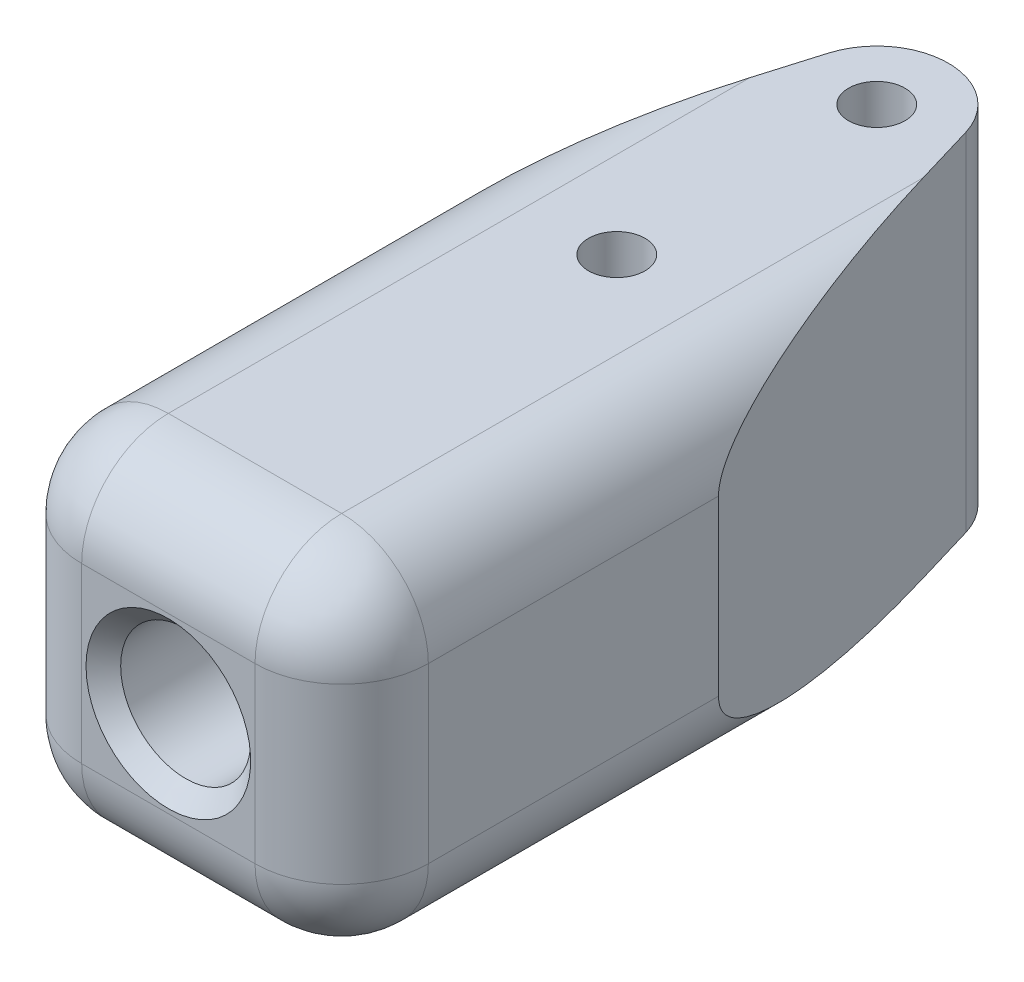
ISO-10303-21;
HEADER;
FILE_DESCRIPTION(('STEP AP214'),'2;1');
FILE_NAME('part.step','',(''),(''),'','','');
FILE_SCHEMA(('AUTOMOTIVE_DESIGN { 1 0 10303 214 1 1 1 1 }'));
ENDSEC;
DATA;
#1=APPLICATION_CONTEXT('core data for automotive mechanical design processes');
#2=APPLICATION_PROTOCOL_DEFINITION('international standard','automotive_design',2000,#1);
#3=PRODUCT_CONTEXT('',#1,'mechanical');
#4=PRODUCT('Part','Part','',(#3));
#5=PRODUCT_RELATED_PRODUCT_CATEGORY('part','',(#4));
#6=PRODUCT_DEFINITION_FORMATION('','',#4);
#7=PRODUCT_DEFINITION_CONTEXT('part definition',#1,'design');
#8=PRODUCT_DEFINITION('design','',#6,#7);
#9=PRODUCT_DEFINITION_SHAPE('','',#8);
#10=(LENGTH_UNIT() NAMED_UNIT(*) SI_UNIT(.MILLI.,.METRE.));
#11=(NAMED_UNIT(*) PLANE_ANGLE_UNIT() SI_UNIT($,.RADIAN.));
#12=(NAMED_UNIT(*) SI_UNIT($,.STERADIAN.) SOLID_ANGLE_UNIT());
#13=UNCERTAINTY_MEASURE_WITH_UNIT(LENGTH_MEASURE(1.E-05),#10,'distance_accuracy_value','');
#14=(GEOMETRIC_REPRESENTATION_CONTEXT(3) GLOBAL_UNCERTAINTY_ASSIGNED_CONTEXT((#13)) GLOBAL_UNIT_ASSIGNED_CONTEXT((#10,
#11,#12)) REPRESENTATION_CONTEXT('',''));
#15=CARTESIAN_POINT('',(0.,0.,0.));
#16=DIRECTION('',(0.,0.,1.));
#17=DIRECTION('',(1.,0.,0.));
#18=AXIS2_PLACEMENT_3D('',#15,#16,#17);
#19=CARTESIAN_POINT('',(12.7,-12.7,57.15));
#20=DIRECTION('',(0.,1.,0.));
#21=DIRECTION('',(-1.,0.,0.));
#22=AXIS2_PLACEMENT_3D('',#19,#20,#21);
#23=PLANE('',#22);
#24=CARTESIAN_POINT('',(0.,-12.7,24.2951));
#25=DIRECTION('',(0.,1.,0.));
#26=DIRECTION('',(-1.,0.,0.));
#27=AXIS2_PLACEMENT_3D('',#24,#25,#26);
#28=CIRCLE('',#27,2.0701);
#29=CARTESIAN_POINT('',(-2.0701,-12.7,24.2951));
#30=VERTEX_POINT('',#29);
#31=EDGE_CURVE('E324',#30,#30,#28,.T.);
#32=ORIENTED_EDGE('',*,*,#31,.T.);
#33=EDGE_LOOP('',(#32));
#34=FACE_BOUND('',#33,.T.);
#35=CARTESIAN_POINT('',(0.,-12.7,5.2451));
#36=DIRECTION('',(0.,1.,0.));
#37=DIRECTION('',(-1.,0.,0.));
#38=AXIS2_PLACEMENT_3D('',#35,#36,#37);
#39=CIRCLE('',#38,2.0701);
#40=CARTESIAN_POINT('',(-2.0701,-12.7,5.2451));
#41=VERTEX_POINT('',#40);
#42=EDGE_CURVE('E327',#41,#41,#39,.T.);
#43=ORIENTED_EDGE('',*,*,#42,.T.);
#44=EDGE_LOOP('',(#43));
#45=FACE_BOUND('',#44,.T.);
#46=DIRECTION('',(1.,0.,0.));
#47=VECTOR('',#46,1.);
#48=CARTESIAN_POINT('',(12.7,-12.7,50.8));
#49=LINE('',#48,#47);
#50=CARTESIAN_POINT('',(6.35,-12.7,50.8));
#51=VERTEX_POINT('',#50);
#52=CARTESIAN_POINT('',(-6.35,-12.7,50.8));
#53=VERTEX_POINT('',#52);
#54=EDGE_CURVE('E351',#51,#53,#49,.F.);
#55=ORIENTED_EDGE('',*,*,#54,.T.);
#56=DIRECTION('',(0.,0.,-1.));
#57=VECTOR('',#56,1.);
#58=CARTESIAN_POINT('',(-6.35,-12.7,57.15));
#59=LINE('',#58,#57);
#60=CARTESIAN_POINT('',(-6.35,-12.7,8.19542875797748));
#61=VERTEX_POINT('',#60);
#62=EDGE_CURVE('E301',#53,#61,#59,.T.);
#63=ORIENTED_EDGE('',*,*,#62,.T.);
#64=DIRECTION('',(0.285145907768039,0.,-0.958484121560259));
#65=VECTOR('',#64,1.);
#66=CARTESIAN_POINT('',(-3.59381819348919,-12.7,-1.06914922019534));
#67=LINE('',#66,#65);
#68=CARTESIAN_POINT('',(-5.02734506599571,-12.7,3.74948119916586));
#69=VERTEX_POINT('',#68);
#70=EDGE_CURVE('E296',#61,#69,#67,.T.);
#71=ORIENTED_EDGE('',*,*,#70,.T.);
#72=CARTESIAN_POINT('',(0.,-12.7,5.2451));
#73=DIRECTION('',(0.,1.,0.));
#74=DIRECTION('',(-1.,0.,0.));
#75=AXIS2_PLACEMENT_3D('',#72,#73,#74);
#76=CIRCLE('',#75,5.2451);
#77=CARTESIAN_POINT('',(5.02734506599572,-12.7,3.74948119916586));
#78=VERTEX_POINT('',#77);
#79=EDGE_CURVE('E299',#78,#69,#76,.T.);
#80=ORIENTED_EDGE('',*,*,#79,.F.);
#81=DIRECTION('',(-0.285145907768039,0.,-0.958484121560259));
#82=VECTOR('',#81,1.);
#83=CARTESIAN_POINT('',(3.5938181934892,-12.7,-1.06914922019534));
#84=LINE('',#83,#82);
#85=CARTESIAN_POINT('',(6.35,-12.7,8.19542875797748));
#86=VERTEX_POINT('',#85);
#87=EDGE_CURVE('E313',#86,#78,#84,.T.);
#88=ORIENTED_EDGE('',*,*,#87,.F.);
#89=DIRECTION('',(0.,0.,-1.));
#90=VECTOR('',#89,1.);
#91=CARTESIAN_POINT('',(6.35,-12.7,57.15));
#92=LINE('',#91,#90);
#93=EDGE_CURVE('E353',#86,#51,#92,.F.);
#94=ORIENTED_EDGE('',*,*,#93,.T.);
#95=EDGE_LOOP('',(#55,#63,#71,#80,#88,#94));
#96=FACE_BOUND('',#95,.T.);
#97=ADVANCED_FACE('F203',(#34,#45,#96),#23,.F.);
#98=CARTESIAN_POINT('',(12.7,12.7,57.15));
#99=DIRECTION('',(0.,-1.,0.));
#100=DIRECTION('',(1.,0.,0.));
#101=AXIS2_PLACEMENT_3D('',#98,#99,#100);
#102=PLANE('',#101);
#103=CARTESIAN_POINT('',(0.,12.7,24.2951));
#104=DIRECTION('',(0.,-1.,0.));
#105=DIRECTION('',(1.,0.,0.));
#106=AXIS2_PLACEMENT_3D('',#103,#104,#105);
#107=CIRCLE('',#106,2.0701);
#108=CARTESIAN_POINT('',(-2.0701,12.7,24.2951));
#109=VERTEX_POINT('',#108);
#110=EDGE_CURVE('E305',#109,#109,#107,.T.);
#111=ORIENTED_EDGE('',*,*,#110,.T.);
#112=EDGE_LOOP('',(#111));
#113=FACE_BOUND('',#112,.T.);
#114=CARTESIAN_POINT('',(0.,12.7,5.2451));
#115=DIRECTION('',(0.,-1.,0.));
#116=DIRECTION('',(1.,0.,0.));
#117=AXIS2_PLACEMENT_3D('',#114,#115,#116);
#118=CIRCLE('',#117,2.0701);
#119=CARTESIAN_POINT('',(-2.0701,12.7,5.2451));
#120=VERTEX_POINT('',#119);
#121=EDGE_CURVE('E314',#120,#120,#118,.T.);
#122=ORIENTED_EDGE('',*,*,#121,.T.);
#123=EDGE_LOOP('',(#122));
#124=FACE_BOUND('',#123,.T.);
#125=DIRECTION('',(-1.,0.,0.));
#126=VECTOR('',#125,1.);
#127=CARTESIAN_POINT('',(12.7,12.7,50.8));
#128=LINE('',#127,#126);
#129=CARTESIAN_POINT('',(-6.35,12.7,50.8));
#130=VERTEX_POINT('',#129);
#131=CARTESIAN_POINT('',(6.35,12.7,50.8));
#132=VERTEX_POINT('',#131);
#133=EDGE_CURVE('E396',#130,#132,#128,.F.);
#134=ORIENTED_EDGE('',*,*,#133,.T.);
#135=DIRECTION('',(0.,0.,-1.));
#136=VECTOR('',#135,1.);
#137=CARTESIAN_POINT('',(6.35,12.7,57.15));
#138=LINE('',#137,#136);
#139=CARTESIAN_POINT('',(6.35,12.7,8.19542875797748));
#140=VERTEX_POINT('',#139);
#141=EDGE_CURVE('E398',#132,#140,#138,.T.);
#142=ORIENTED_EDGE('',*,*,#141,.T.);
#143=DIRECTION('',(-0.285145907768039,0.,-0.958484121560259));
#144=VECTOR('',#143,1.);
#145=CARTESIAN_POINT('',(3.5938181934892,12.7,-1.06914922019534));
#146=LINE('',#145,#144);
#147=CARTESIAN_POINT('',(5.02734506599572,12.7,3.74948119916586));
#148=VERTEX_POINT('',#147);
#149=EDGE_CURVE('E336',#148,#140,#146,.F.);
#150=ORIENTED_EDGE('',*,*,#149,.F.);
#151=CARTESIAN_POINT('',(0.,12.7,5.2451));
#152=DIRECTION('',(0.,1.,0.));
#153=DIRECTION('',(-1.,0.,0.));
#154=AXIS2_PLACEMENT_3D('',#151,#152,#153);
#155=CIRCLE('',#154,5.2451);
#156=CARTESIAN_POINT('',(-5.02734506599572,12.7,3.74948119916586));
#157=VERTEX_POINT('',#156);
#158=EDGE_CURVE('E335',#148,#157,#155,.T.);
#159=ORIENTED_EDGE('',*,*,#158,.T.);
#160=DIRECTION('',(0.285145907768039,0.,-0.958484121560259));
#161=VECTOR('',#160,1.);
#162=CARTESIAN_POINT('',(-3.5938181934892,12.7,-1.06914922019535));
#163=LINE('',#162,#161);
#164=CARTESIAN_POINT('',(-6.35,12.7,8.19542875797749));
#165=VERTEX_POINT('',#164);
#166=EDGE_CURVE('E318',#165,#157,#163,.T.);
#167=ORIENTED_EDGE('',*,*,#166,.F.);
#168=DIRECTION('',(0.,0.,-1.));
#169=VECTOR('',#168,1.);
#170=CARTESIAN_POINT('',(-6.35,12.7,57.15));
#171=LINE('',#170,#169);
#172=EDGE_CURVE('E375',#165,#130,#171,.F.);
#173=ORIENTED_EDGE('',*,*,#172,.T.);
#174=EDGE_LOOP('',(#134,#142,#150,#159,#167,#173));
#175=FACE_BOUND('',#174,.T.);
#176=ADVANCED_FACE('F430',(#113,#124,#175),#102,.F.);
#177=CARTESIAN_POINT('',(12.7,12.7,57.15));
#178=DIRECTION('',(-1.,0.,0.));
#179=DIRECTION('',(0.,-1.,0.));
#180=AXIS2_PLACEMENT_3D('',#177,#178,#179);
#181=PLANE('',#180);
#182=DIRECTION('',(0.,1.,0.));
#183=VECTOR('',#182,1.);
#184=CARTESIAN_POINT('',(12.7,-12.7,29.5402));
#185=LINE('',#184,#183);
#186=CARTESIAN_POINT('',(12.7,-6.35,29.5402));
#187=VERTEX_POINT('',#186);
#188=CARTESIAN_POINT('',(12.7,6.35,29.5402));
#189=VERTEX_POINT('',#188);
#190=EDGE_CURVE('E332',#187,#189,#185,.T.);
#191=ORIENTED_EDGE('',*,*,#190,.T.);
#192=DIRECTION('',(0.,0.,-1.));
#193=VECTOR('',#192,1.);
#194=CARTESIAN_POINT('',(12.7,6.35,57.15));
#195=LINE('',#194,#193);
#196=CARTESIAN_POINT('',(12.7,6.35,50.8));
#197=VERTEX_POINT('',#196);
#198=EDGE_CURVE('E403',#189,#197,#195,.F.);
#199=ORIENTED_EDGE('',*,*,#198,.T.);
#200=DIRECTION('',(0.,1.,0.));
#201=VECTOR('',#200,1.);
#202=CARTESIAN_POINT('',(12.7,12.7,50.8));
#203=LINE('',#202,#201);
#204=CARTESIAN_POINT('',(12.7,-6.34999999999999,50.8));
#205=VERTEX_POINT('',#204);
#206=EDGE_CURVE('E362',#197,#205,#203,.F.);
#207=ORIENTED_EDGE('',*,*,#206,.T.);
#208=DIRECTION('',(0.,0.,-1.));
#209=VECTOR('',#208,1.);
#210=CARTESIAN_POINT('',(12.7,-6.34999999999999,57.15));
#211=LINE('',#210,#209);
#212=EDGE_CURVE('E364',#205,#187,#211,.T.);
#213=ORIENTED_EDGE('',*,*,#212,.T.);
#214=EDGE_LOOP('',(#191,#199,#207,#213));
#215=FACE_BOUND('',#214,.T.);
#216=ADVANCED_FACE('F473',(#215),#181,.F.);
#217=CARTESIAN_POINT('',(-12.7,12.7,57.15));
#218=DIRECTION('',(1.,0.,0.));
#219=DIRECTION('',(0.,1.,0.));
#220=AXIS2_PLACEMENT_3D('',#217,#218,#219);
#221=PLANE('',#220);
#222=DIRECTION('',(0.,-1.,0.));
#223=VECTOR('',#222,1.);
#224=CARTESIAN_POINT('',(-12.7,12.7,50.8));
#225=LINE('',#224,#223);
#226=CARTESIAN_POINT('',(-12.7,-6.35,50.8));
#227=VERTEX_POINT('',#226);
#228=CARTESIAN_POINT('',(-12.7,6.35,50.8));
#229=VERTEX_POINT('',#228);
#230=EDGE_CURVE('E358',#227,#229,#225,.F.);
#231=ORIENTED_EDGE('',*,*,#230,.T.);
#232=DIRECTION('',(0.,0.,-1.));
#233=VECTOR('',#232,1.);
#234=CARTESIAN_POINT('',(-12.7,6.35,57.15));
#235=LINE('',#234,#233);
#236=CARTESIAN_POINT('',(-12.7,6.35,29.5402));
#237=VERTEX_POINT('',#236);
#238=EDGE_CURVE('E212',#229,#237,#235,.T.);
#239=ORIENTED_EDGE('',*,*,#238,.T.);
#240=DIRECTION('',(0.,1.,0.));
#241=VECTOR('',#240,1.);
#242=CARTESIAN_POINT('',(-12.7,-12.7,29.5402));
#243=LINE('',#242,#241);
#244=CARTESIAN_POINT('',(-12.7,-6.35,29.5402));
#245=VERTEX_POINT('',#244);
#246=EDGE_CURVE('E320',#245,#237,#243,.T.);
#247=ORIENTED_EDGE('',*,*,#246,.F.);
#248=DIRECTION('',(0.,0.,-1.));
#249=VECTOR('',#248,1.);
#250=CARTESIAN_POINT('',(-12.7,-6.35,57.15));
#251=LINE('',#250,#249);
#252=EDGE_CURVE('E360',#245,#227,#251,.F.);
#253=ORIENTED_EDGE('',*,*,#252,.T.);
#254=EDGE_LOOP('',(#231,#239,#247,#253));
#255=FACE_BOUND('',#254,.T.);
#256=ADVANCED_FACE('F457',(#255),#221,.F.);
#257=CARTESIAN_POINT('',(0.,0.,57.15));
#258=DIRECTION('',(0.,0.,-1.));
#259=DIRECTION('',(-1.,0.,0.));
#260=AXIS2_PLACEMENT_3D('',#257,#258,#259);
#261=PLANE('',#260);
#262=CARTESIAN_POINT('',(0.,0.,57.15));
#263=DIRECTION('',(0.,0.,-1.));
#264=DIRECTION('',(-1.,0.,0.));
#265=AXIS2_PLACEMENT_3D('',#262,#263,#264);
#266=CIRCLE('',#265,6.0325);
#267=CARTESIAN_POINT('',(-6.0325,0.,57.15));
#268=VERTEX_POINT('',#267);
#269=EDGE_CURVE('E348',#268,#268,#266,.T.);
#270=ORIENTED_EDGE('',*,*,#269,.T.);
#271=EDGE_LOOP('',(#270));
#272=FACE_BOUND('',#271,.T.);
#273=DIRECTION('',(0.,1.,0.));
#274=VECTOR('',#273,1.);
#275=CARTESIAN_POINT('',(6.35,0.,57.15));
#276=LINE('',#275,#274);
#277=CARTESIAN_POINT('',(6.35,-6.35,57.15));
#278=VERTEX_POINT('',#277);
#279=CARTESIAN_POINT('',(6.35,6.35,57.15));
#280=VERTEX_POINT('',#279);
#281=EDGE_CURVE('E368',#278,#280,#276,.T.);
#282=ORIENTED_EDGE('',*,*,#281,.T.);
#283=DIRECTION('',(-1.,0.,0.));
#284=VECTOR('',#283,1.);
#285=CARTESIAN_POINT('',(0.,6.35,57.15));
#286=LINE('',#285,#284);
#287=CARTESIAN_POINT('',(-6.35,6.35,57.15));
#288=VERTEX_POINT('',#287);
#289=EDGE_CURVE('E407',#280,#288,#286,.T.);
#290=ORIENTED_EDGE('',*,*,#289,.T.);
#291=DIRECTION('',(0.,-1.,0.));
#292=VECTOR('',#291,1.);
#293=CARTESIAN_POINT('',(-6.35,0.,57.15));
#294=LINE('',#293,#292);
#295=CARTESIAN_POINT('',(-6.35,-6.35,57.15));
#296=VERTEX_POINT('',#295);
#297=EDGE_CURVE('E373',#288,#296,#294,.T.);
#298=ORIENTED_EDGE('',*,*,#297,.T.);
#299=DIRECTION('',(1.,0.,0.));
#300=VECTOR('',#299,1.);
#301=CARTESIAN_POINT('',(0.,-6.35,57.15));
#302=LINE('',#301,#300);
#303=EDGE_CURVE('E371',#296,#278,#302,.T.);
#304=ORIENTED_EDGE('',*,*,#303,.T.);
#305=EDGE_LOOP('',(#282,#290,#298,#304));
#306=FACE_BOUND('',#305,.T.);
#307=ADVANCED_FACE('F460',(#272,#306),#261,.F.);
#308=CARTESIAN_POINT('',(3.5938181934892,-12.7,-1.06914922019534));
#309=DIRECTION('',(0.958484121560259,0.,-0.285145907768039));
#310=DIRECTION('',(-0.285145907768039,0.,-0.958484121560259));
#311=AXIS2_PLACEMENT_3D('',#308,#309,#310);
#312=PLANE('',#311);
#313=ORIENTED_EDGE('',*,*,#149,.T.);
#314=CARTESIAN_POINT('',(6.35,6.35,8.19542875797748));
#315=DIRECTION('',(0.958484121560259,0.,-0.285145907768039));
#316=DIRECTION('',(-0.285145907768039,0.,-0.958484121560259));
#317=AXIS2_PLACEMENT_3D('',#314,#315,#316);
#318=ELLIPSE('',#317,22.2693008281417,6.35);
#319=EDGE_CURVE('E401',#140,#189,#318,.T.);
#320=ORIENTED_EDGE('',*,*,#319,.T.);
#321=ORIENTED_EDGE('',*,*,#190,.F.);
#322=CARTESIAN_POINT('',(6.35,-6.34999999999999,8.19542875797748));
#323=DIRECTION('',(0.958484121560259,0.,-0.285145907768039));
#324=DIRECTION('',(-0.285145907768039,0.,-0.958484121560259));
#325=AXIS2_PLACEMENT_3D('',#322,#323,#324);
#326=ELLIPSE('',#325,22.2693008281417,6.35);
#327=EDGE_CURVE('E366',#187,#86,#326,.T.);
#328=ORIENTED_EDGE('',*,*,#327,.T.);
#329=ORIENTED_EDGE('',*,*,#87,.T.);
#330=DIRECTION('',(0.,1.,0.));
#331=VECTOR('',#330,1.);
#332=CARTESIAN_POINT('',(5.02734506599572,-12.7,3.74948119916586));
#333=LINE('',#332,#331);
#334=EDGE_CURVE('E312',#78,#148,#333,.T.);
#335=ORIENTED_EDGE('',*,*,#334,.T.);
#336=EDGE_LOOP('',(#313,#320,#321,#328,#329,#335));
#337=FACE_BOUND('',#336,.T.);
#338=ADVANCED_FACE('F433',(#337),#312,.T.);
#339=CARTESIAN_POINT('',(0.,-12.7,5.2451));
#340=DIRECTION('',(0.,1.,0.));
#341=DIRECTION('',(-1.,0.,0.));
#342=AXIS2_PLACEMENT_3D('',#339,#340,#341);
#343=CYLINDRICAL_SURFACE('',#342,5.2451);
#344=ORIENTED_EDGE('',*,*,#158,.F.);
#345=ORIENTED_EDGE('',*,*,#334,.F.);
#346=ORIENTED_EDGE('',*,*,#79,.T.);
#347=DIRECTION('',(0.,1.,0.));
#348=VECTOR('',#347,1.);
#349=CARTESIAN_POINT('',(-5.02734506599571,-12.7,3.74948119916586));
#350=LINE('',#349,#348);
#351=EDGE_CURVE('E304',#69,#157,#350,.T.);
#352=ORIENTED_EDGE('',*,*,#351,.T.);
#353=EDGE_LOOP('',(#344,#345,#346,#352));
#354=FACE_BOUND('',#353,.T.);
#355=ADVANCED_FACE('F310',(#354),#343,.T.);
#356=CARTESIAN_POINT('',(0.,-12.7,5.2451));
#357=DIRECTION('',(0.,1.,0.));
#358=DIRECTION('',(-1.,0.,0.));
#359=AXIS2_PLACEMENT_3D('',#356,#357,#358);
#360=CYLINDRICAL_SURFACE('',#359,2.0701);
#361=CARTESIAN_POINT('',(-2.0701,-12.7,5.2451));
#362=CARTESIAN_POINT('',(-2.0701,-12.4354166666667,5.2451));
#363=CARTESIAN_POINT('',(-2.0701,-12.1708333333333,5.2451));
#364=CARTESIAN_POINT('',(-2.0701,-11.6416666666667,5.2451));
#365=CARTESIAN_POINT('',(-2.0701,-11.3770833333333,5.2451));
#366=CARTESIAN_POINT('',(-2.0701,-10.8479166666667,5.2451));
#367=CARTESIAN_POINT('',(-2.0701,-10.5833333333333,5.2451));
#368=CARTESIAN_POINT('',(-2.0701,-10.0541666666667,5.2451));
#369=CARTESIAN_POINT('',(-2.0701,-9.78958333333333,5.2451));
#370=CARTESIAN_POINT('',(-2.0701,-9.26041666666667,5.2451));
#371=CARTESIAN_POINT('',(-2.0701,-8.99583333333333,5.2451));
#372=CARTESIAN_POINT('',(-2.0701,-8.46666666666667,5.2451));
#373=CARTESIAN_POINT('',(-2.0701,-8.20208333333333,5.2451));
#374=CARTESIAN_POINT('',(-2.0701,-7.67291666666667,5.2451));
#375=CARTESIAN_POINT('',(-2.0701,-7.40833333333333,5.2451));
#376=CARTESIAN_POINT('',(-2.0701,-6.87916666666667,5.2451));
#377=CARTESIAN_POINT('',(-2.0701,-6.61458333333333,5.2451));
#378=CARTESIAN_POINT('',(-2.0701,-6.08541666666667,5.2451));
#379=CARTESIAN_POINT('',(-2.0701,-5.82083333333333,5.2451));
#380=CARTESIAN_POINT('',(-2.0701,-5.29166666666667,5.2451));
#381=CARTESIAN_POINT('',(-2.0701,-5.02708333333333,5.2451));
#382=CARTESIAN_POINT('',(-2.0701,-4.49791666666667,5.2451));
#383=CARTESIAN_POINT('',(-2.0701,-4.23333333333333,5.2451));
#384=CARTESIAN_POINT('',(-2.0701,-3.70416666666667,5.2451));
#385=CARTESIAN_POINT('',(-2.0701,-3.43958333333333,5.2451));
#386=CARTESIAN_POINT('',(-2.0701,-2.91041666666667,5.2451));
#387=CARTESIAN_POINT('',(-2.0701,-2.64583333333333,5.2451));
#388=CARTESIAN_POINT('',(-2.0701,-2.11666666666667,5.2451));
#389=CARTESIAN_POINT('',(-2.0701,-1.85208333333333,5.2451));
#390=CARTESIAN_POINT('',(-2.0701,-1.32291666666666,5.2451));
#391=CARTESIAN_POINT('',(-2.0701,-1.05833333333333,5.2451));
#392=CARTESIAN_POINT('',(-2.0701,-0.529166666666664,5.2451));
#393=CARTESIAN_POINT('',(-2.0701,-0.264583333333331,5.2451));
#394=CARTESIAN_POINT('',(-2.0701,0.264583333333335,5.2451));
#395=CARTESIAN_POINT('',(-2.0701,0.529166666666668,5.2451));
#396=CARTESIAN_POINT('',(-2.0701,1.05833333333333,5.2451));
#397=CARTESIAN_POINT('',(-2.0701,1.32291666666667,5.2451));
#398=CARTESIAN_POINT('',(-2.0701,1.85208333333334,5.2451));
#399=CARTESIAN_POINT('',(-2.0701,2.11666666666667,5.2451));
#400=CARTESIAN_POINT('',(-2.0701,2.64583333333334,5.2451));
#401=CARTESIAN_POINT('',(-2.0701,2.91041666666667,5.2451));
#402=CARTESIAN_POINT('',(-2.0701,3.43958333333333,5.2451));
#403=CARTESIAN_POINT('',(-2.0701,3.70416666666667,5.2451));
#404=CARTESIAN_POINT('',(-2.0701,4.23333333333333,5.2451));
#405=CARTESIAN_POINT('',(-2.0701,4.49791666666667,5.2451));
#406=CARTESIAN_POINT('',(-2.0701,5.02708333333334,5.2451));
#407=CARTESIAN_POINT('',(-2.0701,5.29166666666667,5.2451));
#408=CARTESIAN_POINT('',(-2.0701,5.82083333333333,5.2451));
#409=CARTESIAN_POINT('',(-2.0701,6.08541666666667,5.2451));
#410=CARTESIAN_POINT('',(-2.0701,6.61458333333333,5.2451));
#411=CARTESIAN_POINT('',(-2.0701,6.87916666666667,5.2451));
#412=CARTESIAN_POINT('',(-2.0701,7.40833333333333,5.2451));
#413=CARTESIAN_POINT('',(-2.0701,7.67291666666667,5.2451));
#414=CARTESIAN_POINT('',(-2.0701,8.20208333333333,5.2451));
#415=CARTESIAN_POINT('',(-2.0701,8.46666666666667,5.2451));
#416=CARTESIAN_POINT('',(-2.0701,8.99583333333334,5.2451));
#417=CARTESIAN_POINT('',(-2.0701,9.26041666666667,5.2451));
#418=CARTESIAN_POINT('',(-2.0701,9.78958333333334,5.2451));
#419=CARTESIAN_POINT('',(-2.0701,10.0541666666667,5.2451));
#420=CARTESIAN_POINT('',(-2.0701,10.5833333333333,5.2451));
#421=CARTESIAN_POINT('',(-2.0701,10.8479166666667,5.2451));
#422=CARTESIAN_POINT('',(-2.0701,11.3770833333333,5.2451));
#423=CARTESIAN_POINT('',(-2.0701,11.6416666666667,5.2451));
#424=CARTESIAN_POINT('',(-2.0701,12.1708333333333,5.2451));
#425=CARTESIAN_POINT('',(-2.0701,12.4354166666667,5.2451));
#426=CARTESIAN_POINT('',(-2.0701,12.7,5.2451));
#427=B_SPLINE_CURVE_WITH_KNOTS('',3,(#361,#362,#363,#364,#365,#366,#367,#368,#369,#370,#371,
#372,#373,#374,#375,#376,#377,#378,#379,#380,#381,#382,#383,#384,#385,#386,#387,#388,#389,#390,
#391,#392,#393,#394,#395,#396,#397,#398,#399,#400,#401,#402,#403,#404,#405,#406,#407,#408,#409,
#410,#411,#412,#413,#414,#415,#416,#417,#418,#419,#420,#421,#422,#423,#424,#425,#426),
.UNSPECIFIED.,.F.,.F.,(4,2,2,2,2,2,2,2,2,2,2,2,2,2,2,2,2,2,2,2,2,2,2,2,2,2,2,2,2,2,2,2,4),(0.,
0.793749999999999,1.5875,2.38125,3.175,3.96875,4.7625,5.55625,6.35,7.14375,7.9375,8.73125,9.525,
10.31875,11.1125,11.90625,12.7,13.49375,14.2875,15.08125,15.875,16.66875,17.4625,18.25625,19.05,
19.84375,20.6375,21.43125,22.225,23.01875,23.8125,24.60625,25.4),.UNSPECIFIED.);
#428=EDGE_CURVE('BSEAM614',#41,#120,#427,.T.);
#429=ORIENTED_EDGE('',*,*,#42,.F.);
#430=ORIENTED_EDGE('',*,*,#121,.F.);
#431=ORIENTED_EDGE('',*,*,#428,.T.);
#432=ORIENTED_EDGE('',*,*,#428,.F.);
#433=EDGE_LOOP('',(#429,#431,#430,#432));
#434=FACE_BOUND('',#433,.T.);
#435=ADVANCED_FACE('F614',(#434),#360,.F.);
#436=CARTESIAN_POINT('',(-3.59381819348919,-12.7,-1.06914922019534));
#437=DIRECTION('',(0.958484121560259,0.,0.285145907768039));
#438=DIRECTION('',(0.285145907768039,0.,-0.958484121560259));
#439=AXIS2_PLACEMENT_3D('',#436,#437,#438);
#440=PLANE('',#439);
#441=ORIENTED_EDGE('',*,*,#246,.T.);
#442=CARTESIAN_POINT('',(-6.35,6.35,8.19542875797748));
#443=DIRECTION('',(0.958484121560259,0.,0.285145907768039));
#444=DIRECTION('',(0.285145907768039,0.,-0.958484121560259));
#445=AXIS2_PLACEMENT_3D('',#442,#443,#444);
#446=ELLIPSE('',#445,22.2693008281417,6.35);
#447=EDGE_CURVE('E12',#237,#165,#446,.F.);
#448=ORIENTED_EDGE('',*,*,#447,.T.);
#449=ORIENTED_EDGE('',*,*,#166,.T.);
#450=ORIENTED_EDGE('',*,*,#351,.F.);
#451=ORIENTED_EDGE('',*,*,#70,.F.);
#452=CARTESIAN_POINT('',(-6.35,-6.35,8.19542875797748));
#453=DIRECTION('',(0.958484121560259,0.,0.285145907768039));
#454=DIRECTION('',(0.285145907768039,0.,-0.958484121560259));
#455=AXIS2_PLACEMENT_3D('',#452,#453,#454);
#456=ELLIPSE('',#455,22.2693008281417,6.35);
#457=EDGE_CURVE('E356',#61,#245,#456,.F.);
#458=ORIENTED_EDGE('',*,*,#457,.T.);
#459=EDGE_LOOP('',(#441,#448,#449,#450,#451,#458));
#460=FACE_BOUND('',#459,.T.);
#461=ADVANCED_FACE('F316',(#460),#440,.F.);
#462=CARTESIAN_POINT('',(0.,-12.7,24.2951));
#463=DIRECTION('',(0.,1.,0.));
#464=DIRECTION('',(-1.,0.,0.));
#465=AXIS2_PLACEMENT_3D('',#462,#463,#464);
#466=CYLINDRICAL_SURFACE('',#465,2.0701);
#467=CARTESIAN_POINT('',(-2.0701,-12.7,24.2951));
#468=CARTESIAN_POINT('',(-2.0701,-12.4354166666667,24.2951));
#469=CARTESIAN_POINT('',(-2.0701,-12.1708333333333,24.2951));
#470=CARTESIAN_POINT('',(-2.0701,-11.6416666666667,24.2951));
#471=CARTESIAN_POINT('',(-2.0701,-11.3770833333333,24.2951));
#472=CARTESIAN_POINT('',(-2.0701,-10.8479166666667,24.2951));
#473=CARTESIAN_POINT('',(-2.0701,-10.5833333333333,24.2951));
#474=CARTESIAN_POINT('',(-2.0701,-10.0541666666667,24.2951));
#475=CARTESIAN_POINT('',(-2.0701,-9.78958333333333,24.2951));
#476=CARTESIAN_POINT('',(-2.0701,-9.26041666666667,24.2951));
#477=CARTESIAN_POINT('',(-2.0701,-8.99583333333333,24.2951));
#478=CARTESIAN_POINT('',(-2.0701,-8.46666666666667,24.2951));
#479=CARTESIAN_POINT('',(-2.0701,-8.20208333333333,24.2951));
#480=CARTESIAN_POINT('',(-2.0701,-7.67291666666667,24.2951));
#481=CARTESIAN_POINT('',(-2.0701,-7.40833333333333,24.2951));
#482=CARTESIAN_POINT('',(-2.0701,-6.87916666666667,24.2951));
#483=CARTESIAN_POINT('',(-2.0701,-6.61458333333333,24.2951));
#484=CARTESIAN_POINT('',(-2.0701,-6.08541666666667,24.2951));
#485=CARTESIAN_POINT('',(-2.0701,-5.82083333333333,24.2951));
#486=CARTESIAN_POINT('',(-2.0701,-5.29166666666667,24.2951));
#487=CARTESIAN_POINT('',(-2.0701,-5.02708333333333,24.2951));
#488=CARTESIAN_POINT('',(-2.0701,-4.49791666666667,24.2951));
#489=CARTESIAN_POINT('',(-2.0701,-4.23333333333333,24.2951));
#490=CARTESIAN_POINT('',(-2.0701,-3.70416666666667,24.2951));
#491=CARTESIAN_POINT('',(-2.0701,-3.43958333333333,24.2951));
#492=CARTESIAN_POINT('',(-2.0701,-2.91041666666667,24.2951));
#493=CARTESIAN_POINT('',(-2.0701,-2.64583333333333,24.2951));
#494=CARTESIAN_POINT('',(-2.0701,-2.11666666666667,24.2951));
#495=CARTESIAN_POINT('',(-2.0701,-1.85208333333333,24.2951));
#496=CARTESIAN_POINT('',(-2.0701,-1.32291666666666,24.2951));
#497=CARTESIAN_POINT('',(-2.0701,-1.05833333333333,24.2951));
#498=CARTESIAN_POINT('',(-2.0701,-0.529166666666664,24.2951));
#499=CARTESIAN_POINT('',(-2.0701,-0.264583333333331,24.2951));
#500=CARTESIAN_POINT('',(-2.0701,0.264583333333335,24.2951));
#501=CARTESIAN_POINT('',(-2.0701,0.529166666666668,24.2951));
#502=CARTESIAN_POINT('',(-2.0701,1.05833333333333,24.2951));
#503=CARTESIAN_POINT('',(-2.0701,1.32291666666667,24.2951));
#504=CARTESIAN_POINT('',(-2.0701,1.85208333333334,24.2951));
#505=CARTESIAN_POINT('',(-2.0701,2.11666666666667,24.2951));
#506=CARTESIAN_POINT('',(-2.0701,2.64583333333334,24.2951));
#507=CARTESIAN_POINT('',(-2.0701,2.91041666666667,24.2951));
#508=CARTESIAN_POINT('',(-2.0701,3.43958333333333,24.2951));
#509=CARTESIAN_POINT('',(-2.0701,3.70416666666667,24.2951));
#510=CARTESIAN_POINT('',(-2.0701,4.23333333333333,24.2951));
#511=CARTESIAN_POINT('',(-2.0701,4.49791666666667,24.2951));
#512=CARTESIAN_POINT('',(-2.0701,5.02708333333334,24.2951));
#513=CARTESIAN_POINT('',(-2.0701,5.29166666666667,24.2951));
#514=CARTESIAN_POINT('',(-2.0701,5.82083333333333,24.2951));
#515=CARTESIAN_POINT('',(-2.0701,6.08541666666667,24.2951));
#516=CARTESIAN_POINT('',(-2.0701,6.61458333333333,24.2951));
#517=CARTESIAN_POINT('',(-2.0701,6.87916666666667,24.2951));
#518=CARTESIAN_POINT('',(-2.0701,7.40833333333333,24.2951));
#519=CARTESIAN_POINT('',(-2.0701,7.67291666666667,24.2951));
#520=CARTESIAN_POINT('',(-2.0701,8.20208333333333,24.2951));
#521=CARTESIAN_POINT('',(-2.0701,8.46666666666667,24.2951));
#522=CARTESIAN_POINT('',(-2.0701,8.99583333333334,24.2951));
#523=CARTESIAN_POINT('',(-2.0701,9.26041666666667,24.2951));
#524=CARTESIAN_POINT('',(-2.0701,9.78958333333334,24.2951));
#525=CARTESIAN_POINT('',(-2.0701,10.0541666666667,24.2951));
#526=CARTESIAN_POINT('',(-2.0701,10.5833333333333,24.2951));
#527=CARTESIAN_POINT('',(-2.0701,10.8479166666667,24.2951));
#528=CARTESIAN_POINT('',(-2.0701,11.3770833333333,24.2951));
#529=CARTESIAN_POINT('',(-2.0701,11.6416666666667,24.2951));
#530=CARTESIAN_POINT('',(-2.0701,12.1708333333333,24.2951));
#531=CARTESIAN_POINT('',(-2.0701,12.4354166666667,24.2951));
#532=CARTESIAN_POINT('',(-2.0701,12.7,24.2951));
#533=B_SPLINE_CURVE_WITH_KNOTS('',3,(#467,#468,#469,#470,#471,#472,#473,#474,#475,#476,#477,
#478,#479,#480,#481,#482,#483,#484,#485,#486,#487,#488,#489,#490,#491,#492,#493,#494,#495,#496,
#497,#498,#499,#500,#501,#502,#503,#504,#505,#506,#507,#508,#509,#510,#511,#512,#513,#514,#515,
#516,#517,#518,#519,#520,#521,#522,#523,#524,#525,#526,#527,#528,#529,#530,#531,#532),
.UNSPECIFIED.,.F.,.F.,(4,2,2,2,2,2,2,2,2,2,2,2,2,2,2,2,2,2,2,2,2,2,2,2,2,2,2,2,2,2,2,2,4),(0.,
0.793749999999999,1.5875,2.38125,3.175,3.96875,4.7625,5.55625,6.35,7.14375,7.9375,8.73125,9.525,
10.31875,11.1125,11.90625,12.7,13.49375,14.2875,15.08125,15.875,16.66875,17.4625,18.25625,19.05,
19.84375,20.6375,21.43125,22.225,23.01875,23.8125,24.60625,25.4),.UNSPECIFIED.);
#534=EDGE_CURVE('BSEAM613',#30,#109,#533,.T.);
#535=ORIENTED_EDGE('',*,*,#31,.F.);
#536=ORIENTED_EDGE('',*,*,#110,.F.);
#537=ORIENTED_EDGE('',*,*,#534,.T.);
#538=ORIENTED_EDGE('',*,*,#534,.F.);
#539=EDGE_LOOP('',(#535,#537,#536,#538));
#540=FACE_BOUND('',#539,.T.);
#541=ADVANCED_FACE('F613',(#540),#466,.F.);
#542=CARTESIAN_POINT('',(0.,0.,31.75));
#543=DIRECTION('',(0.,0.,1.));
#544=DIRECTION('',(1.,0.,0.));
#545=AXIS2_PLACEMENT_3D('',#542,#543,#544);
#546=CYLINDRICAL_SURFACE('',#545,4.7625);
#547=CARTESIAN_POINT('',(0.,0.,55.88));
#548=DIRECTION('',(0.,0.,-1.));
#549=DIRECTION('',(-1.,0.,0.));
#550=AXIS2_PLACEMENT_3D('',#547,#548,#549);
#551=CIRCLE('',#550,4.7625);
#552=CARTESIAN_POINT('',(-4.7625,0.,55.88));
#553=VERTEX_POINT('',#552);
#554=EDGE_CURVE('E339',#553,#553,#551,.F.);
#555=ORIENTED_EDGE('',*,*,#554,.T.);
#556=EDGE_LOOP('',(#555));
#557=FACE_BOUND('',#556,.T.);
#558=CARTESIAN_POINT('',(0.,0.,31.75));
#559=DIRECTION('',(0.,0.,1.));
#560=DIRECTION('',(1.,0.,0.));
#561=AXIS2_PLACEMENT_3D('',#558,#559,#560);
#562=CIRCLE('',#561,4.7625);
#563=CARTESIAN_POINT('',(4.7625,0.,31.75));
#564=VERTEX_POINT('',#563);
#565=EDGE_CURVE('E394',#564,#564,#562,.T.);
#566=ORIENTED_EDGE('',*,*,#565,.F.);
#567=EDGE_LOOP('',(#566));
#568=FACE_BOUND('',#567,.T.);
#569=ADVANCED_FACE('F629',(#557,#568),#546,.F.);
#570=CARTESIAN_POINT('',(0.,0.,31.75));
#571=DIRECTION('',(0.,0.,1.));
#572=DIRECTION('',(1.,0.,0.));
#573=AXIS2_PLACEMENT_3D('',#570,#571,#572);
#574=PLANE('',#573);
#575=ORIENTED_EDGE('',*,*,#565,.T.);
#576=EDGE_LOOP('',(#575));
#577=FACE_BOUND('',#576,.T.);
#578=ADVANCED_FACE('F487',(#577),#574,.T.);
#579=CARTESIAN_POINT('',(0.,0.,55.88));
#580=DIRECTION('',(0.,0.,1.));
#581=DIRECTION('',(1.,0.,0.));
#582=AXIS2_PLACEMENT_3D('',#579,#580,#581);
#583=CONICAL_SURFACE('',#582,4.7625,0.785398163397449);
#584=ORIENTED_EDGE('',*,*,#269,.F.);
#585=EDGE_LOOP('',(#584));
#586=FACE_BOUND('',#585,.T.);
#587=ORIENTED_EDGE('',*,*,#554,.F.);
#588=EDGE_LOOP('',(#587));
#589=FACE_BOUND('',#588,.T.);
#590=ADVANCED_FACE('F478',(#586,#589),#583,.F.);
#591=CARTESIAN_POINT('',(6.35,0.,50.8));
#592=DIRECTION('',(0.,1.,0.));
#593=DIRECTION('',(-1.,0.,0.));
#594=AXIS2_PLACEMENT_3D('',#591,#592,#593);
#595=CYLINDRICAL_SURFACE('',#594,6.35);
#596=ORIENTED_EDGE('',*,*,#206,.F.);
#597=CARTESIAN_POINT('',(6.35,6.35,50.8));
#598=DIRECTION('',(0.,1.,0.));
#599=DIRECTION('',(-1.,0.,0.));
#600=AXIS2_PLACEMENT_3D('',#597,#598,#599);
#601=CIRCLE('',#600,6.35);
#602=EDGE_CURVE('E405',#197,#280,#601,.F.);
#603=ORIENTED_EDGE('',*,*,#602,.T.);
#604=ORIENTED_EDGE('',*,*,#281,.F.);
#605=CARTESIAN_POINT('',(6.35,-6.34999999999999,50.8));
#606=DIRECTION('',(0.,-1.,0.));
#607=DIRECTION('',(1.,0.,0.));
#608=AXIS2_PLACEMENT_3D('',#605,#606,#607);
#609=CIRCLE('',#608,6.35);
#610=EDGE_CURVE('E391',#205,#278,#609,.T.);
#611=ORIENTED_EDGE('',*,*,#610,.F.);
#612=EDGE_LOOP('',(#596,#603,#604,#611));
#613=FACE_BOUND('',#612,.T.);
#614=ADVANCED_FACE('F476',(#613),#595,.T.);
#615=CARTESIAN_POINT('',(6.35,-6.34999999999999,57.15));
#616=DIRECTION('',(0.,0.,-1.));
#617=DIRECTION('',(-1.,0.,0.));
#618=AXIS2_PLACEMENT_3D('',#615,#616,#617);
#619=CYLINDRICAL_SURFACE('',#618,6.35);
#620=ORIENTED_EDGE('',*,*,#327,.F.);
#621=ORIENTED_EDGE('',*,*,#212,.F.);
#622=CARTESIAN_POINT('',(6.35,-6.35,50.8));
#623=DIRECTION('',(0.,0.,1.));
#624=DIRECTION('',(1.,0.,0.));
#625=AXIS2_PLACEMENT_3D('',#622,#623,#624);
#626=CIRCLE('',#625,6.35);
#627=EDGE_CURVE('E388',#51,#205,#626,.T.);
#628=ORIENTED_EDGE('',*,*,#627,.F.);
#629=ORIENTED_EDGE('',*,*,#93,.F.);
#630=EDGE_LOOP('',(#620,#621,#628,#629));
#631=FACE_BOUND('',#630,.T.);
#632=ADVANCED_FACE('F439',(#631),#619,.T.);
#633=CARTESIAN_POINT('',(6.35,-6.35,50.8));
#634=DIRECTION('',(0.,0.,1.));
#635=DIRECTION('',(1.,0.,0.));
#636=AXIS2_PLACEMENT_3D('',#633,#634,#635);
#637=SPHERICAL_SURFACE('',#636,6.35);
#638=ORIENTED_EDGE('',*,*,#627,.T.);
#639=ORIENTED_EDGE('',*,*,#610,.T.);
#640=CARTESIAN_POINT('',(6.35,-6.35,50.8));
#641=DIRECTION('',(1.,0.,0.));
#642=DIRECTION('',(0.,1.,0.));
#643=AXIS2_PLACEMENT_3D('',#640,#641,#642);
#644=CIRCLE('',#643,6.35);
#645=EDGE_CURVE('E385',#51,#278,#644,.F.);
#646=ORIENTED_EDGE('',*,*,#645,.F.);
#647=EDGE_LOOP('',(#638,#639,#646));
#648=FACE_BOUND('',#647,.T.);
#649=ADVANCED_FACE('F445',(#648),#637,.T.);
#650=CARTESIAN_POINT('',(-6.35,0.,50.8));
#651=DIRECTION('',(0.,-1.,0.));
#652=DIRECTION('',(1.,0.,0.));
#653=AXIS2_PLACEMENT_3D('',#650,#651,#652);
#654=CYLINDRICAL_SURFACE('',#653,6.35);
#655=ORIENTED_EDGE('',*,*,#297,.F.);
#656=CARTESIAN_POINT('',(-6.35,6.35,50.8));
#657=DIRECTION('',(0.,-1.,0.));
#658=DIRECTION('',(1.,0.,0.));
#659=AXIS2_PLACEMENT_3D('',#656,#657,#658);
#660=CIRCLE('',#659,6.35);
#661=EDGE_CURVE('E227',#288,#229,#660,.T.);
#662=ORIENTED_EDGE('',*,*,#661,.T.);
#663=ORIENTED_EDGE('',*,*,#230,.F.);
#664=CARTESIAN_POINT('',(-6.35,-6.35,50.8));
#665=DIRECTION('',(0.,-1.,0.));
#666=DIRECTION('',(1.,0.,0.));
#667=AXIS2_PLACEMENT_3D('',#664,#665,#666);
#668=CIRCLE('',#667,6.35);
#669=EDGE_CURVE('E382',#296,#227,#668,.T.);
#670=ORIENTED_EDGE('',*,*,#669,.F.);
#671=EDGE_LOOP('',(#655,#662,#663,#670));
#672=FACE_BOUND('',#671,.T.);
#673=ADVANCED_FACE('F458',(#672),#654,.T.);
#674=CARTESIAN_POINT('',(0.,-6.35,50.8));
#675=DIRECTION('',(1.,0.,0.));
#676=DIRECTION('',(0.,1.,0.));
#677=AXIS2_PLACEMENT_3D('',#674,#675,#676);
#678=CYLINDRICAL_SURFACE('',#677,6.35);
#679=ORIENTED_EDGE('',*,*,#645,.T.);
#680=ORIENTED_EDGE('',*,*,#303,.F.);
#681=CARTESIAN_POINT('',(-6.35,-6.35,50.8));
#682=DIRECTION('',(-1.,0.,0.));
#683=DIRECTION('',(0.,-1.,0.));
#684=AXIS2_PLACEMENT_3D('',#681,#682,#683);
#685=CIRCLE('',#684,6.35);
#686=EDGE_CURVE('E379',#53,#296,#685,.T.);
#687=ORIENTED_EDGE('',*,*,#686,.F.);
#688=ORIENTED_EDGE('',*,*,#54,.F.);
#689=EDGE_LOOP('',(#679,#680,#687,#688));
#690=FACE_BOUND('',#689,.T.);
#691=ADVANCED_FACE('F449',(#690),#678,.T.);
#692=CARTESIAN_POINT('',(-6.35,-6.35,50.8));
#693=DIRECTION('',(0.,0.,1.));
#694=DIRECTION('',(1.,0.,0.));
#695=AXIS2_PLACEMENT_3D('',#692,#693,#694);
#696=SPHERICAL_SURFACE('',#695,6.35);
#697=ORIENTED_EDGE('',*,*,#686,.T.);
#698=ORIENTED_EDGE('',*,*,#669,.T.);
#699=CARTESIAN_POINT('',(-6.35,-6.35,50.8));
#700=DIRECTION('',(0.,0.,1.));
#701=DIRECTION('',(1.,0.,0.));
#702=AXIS2_PLACEMENT_3D('',#699,#700,#701);
#703=CIRCLE('',#702,6.35);
#704=EDGE_CURVE('E376',#53,#227,#703,.F.);
#705=ORIENTED_EDGE('',*,*,#704,.F.);
#706=EDGE_LOOP('',(#697,#698,#705));
#707=FACE_BOUND('',#706,.T.);
#708=ADVANCED_FACE('F453',(#707),#696,.T.);
#709=CARTESIAN_POINT('',(-6.35,-6.35,57.15));
#710=DIRECTION('',(0.,0.,-1.));
#711=DIRECTION('',(-1.,0.,0.));
#712=AXIS2_PLACEMENT_3D('',#709,#710,#711);
#713=CYLINDRICAL_SURFACE('',#712,6.35);
#714=ORIENTED_EDGE('',*,*,#704,.T.);
#715=ORIENTED_EDGE('',*,*,#252,.F.);
#716=ORIENTED_EDGE('',*,*,#457,.F.);
#717=ORIENTED_EDGE('',*,*,#62,.F.);
#718=EDGE_LOOP('',(#714,#715,#716,#717));
#719=FACE_BOUND('',#718,.T.);
#720=ADVANCED_FACE('F456',(#719),#713,.T.);
#721=CARTESIAN_POINT('',(-6.35,6.35,57.15));
#722=DIRECTION('',(0.,0.,-1.));
#723=DIRECTION('',(-1.,0.,0.));
#724=AXIS2_PLACEMENT_3D('',#721,#722,#723);
#725=CYLINDRICAL_SURFACE('',#724,6.35);
#726=ORIENTED_EDGE('',*,*,#447,.F.);
#727=ORIENTED_EDGE('',*,*,#238,.F.);
#728=CARTESIAN_POINT('',(-6.35,6.35,50.8));
#729=DIRECTION('',(0.,0.,1.));
#730=DIRECTION('',(1.,0.,0.));
#731=AXIS2_PLACEMENT_3D('',#728,#729,#730);
#732=CIRCLE('',#731,6.35);
#733=EDGE_CURVE('E207',#130,#229,#732,.T.);
#734=ORIENTED_EDGE('',*,*,#733,.F.);
#735=ORIENTED_EDGE('',*,*,#172,.F.);
#736=EDGE_LOOP('',(#726,#727,#734,#735));
#737=FACE_BOUND('',#736,.T.);
#738=ADVANCED_FACE('F205',(#737),#725,.T.);
#739=CARTESIAN_POINT('',(-6.35,6.35,50.8));
#740=DIRECTION('',(0.,-1.,0.));
#741=DIRECTION('',(1.,0.,0.));
#742=AXIS2_PLACEMENT_3D('',#739,#740,#741);
#743=SPHERICAL_SURFACE('',#742,6.35);
#744=ORIENTED_EDGE('',*,*,#733,.T.);
#745=ORIENTED_EDGE('',*,*,#661,.F.);
#746=CARTESIAN_POINT('',(-6.35,6.35,50.8));
#747=DIRECTION('',(1.,0.,0.));
#748=DIRECTION('',(0.,1.,0.));
#749=AXIS2_PLACEMENT_3D('',#746,#747,#748);
#750=CIRCLE('',#749,6.35);
#751=EDGE_CURVE('E416',#130,#288,#750,.T.);
#752=ORIENTED_EDGE('',*,*,#751,.F.);
#753=EDGE_LOOP('',(#744,#745,#752));
#754=FACE_BOUND('',#753,.T.);
#755=ADVANCED_FACE('F425',(#754),#743,.T.);
#756=CARTESIAN_POINT('',(0.,6.35,50.8));
#757=DIRECTION('',(-1.,0.,0.));
#758=DIRECTION('',(0.,-1.,0.));
#759=AXIS2_PLACEMENT_3D('',#756,#757,#758);
#760=CYLINDRICAL_SURFACE('',#759,6.35);
#761=ORIENTED_EDGE('',*,*,#751,.T.);
#762=ORIENTED_EDGE('',*,*,#289,.F.);
#763=CARTESIAN_POINT('',(6.35,6.35,50.8));
#764=DIRECTION('',(1.,0.,0.));
#765=DIRECTION('',(0.,1.,0.));
#766=AXIS2_PLACEMENT_3D('',#763,#764,#765);
#767=CIRCLE('',#766,6.35);
#768=EDGE_CURVE('E414',#132,#280,#767,.T.);
#769=ORIENTED_EDGE('',*,*,#768,.F.);
#770=ORIENTED_EDGE('',*,*,#133,.F.);
#771=EDGE_LOOP('',(#761,#762,#769,#770));
#772=FACE_BOUND('',#771,.T.);
#773=ADVANCED_FACE('F463',(#772),#760,.T.);
#774=CARTESIAN_POINT('',(6.35,6.35,50.8));
#775=DIRECTION('',(0.,-1.,0.));
#776=DIRECTION('',(1.,0.,0.));
#777=AXIS2_PLACEMENT_3D('',#774,#775,#776);
#778=SPHERICAL_SURFACE('',#777,6.35);
#779=ORIENTED_EDGE('',*,*,#768,.T.);
#780=ORIENTED_EDGE('',*,*,#602,.F.);
#781=CARTESIAN_POINT('',(6.35,6.35,50.8));
#782=DIRECTION('',(0.,0.,-1.));
#783=DIRECTION('',(-1.,0.,0.));
#784=AXIS2_PLACEMENT_3D('',#781,#782,#783);
#785=CIRCLE('',#784,6.35);
#786=EDGE_CURVE('E411',#132,#197,#785,.T.);
#787=ORIENTED_EDGE('',*,*,#786,.F.);
#788=EDGE_LOOP('',(#779,#780,#787));
#789=FACE_BOUND('',#788,.T.);
#790=ADVANCED_FACE('F467',(#789),#778,.T.);
#791=CARTESIAN_POINT('',(6.35,6.35,57.15));
#792=DIRECTION('',(0.,0.,-1.));
#793=DIRECTION('',(-1.,0.,0.));
#794=AXIS2_PLACEMENT_3D('',#791,#792,#793);
#795=CYLINDRICAL_SURFACE('',#794,6.35);
#796=ORIENTED_EDGE('',*,*,#786,.T.);
#797=ORIENTED_EDGE('',*,*,#198,.F.);
#798=ORIENTED_EDGE('',*,*,#319,.F.);
#799=ORIENTED_EDGE('',*,*,#141,.F.);
#800=EDGE_LOOP('',(#796,#797,#798,#799));
#801=FACE_BOUND('',#800,.T.);
#802=ADVANCED_FACE('F471',(#801),#795,.T.);
#803=CLOSED_SHELL('',(#97,#176,#216,#256,#307,#338,#355,#435,#461,#541,#569,#578,#590,#614,#632,
#649,#673,#691,#708,#720,#738,#755,#773,#790,#802));
#804=MANIFOLD_SOLID_BREP('B2',#803);
#805=ADVANCED_BREP_SHAPE_REPRESENTATION('',(#18,#804),#14);
#806=SHAPE_DEFINITION_REPRESENTATION(#9,#805);
ENDSEC;
END-ISO-10303-21;
